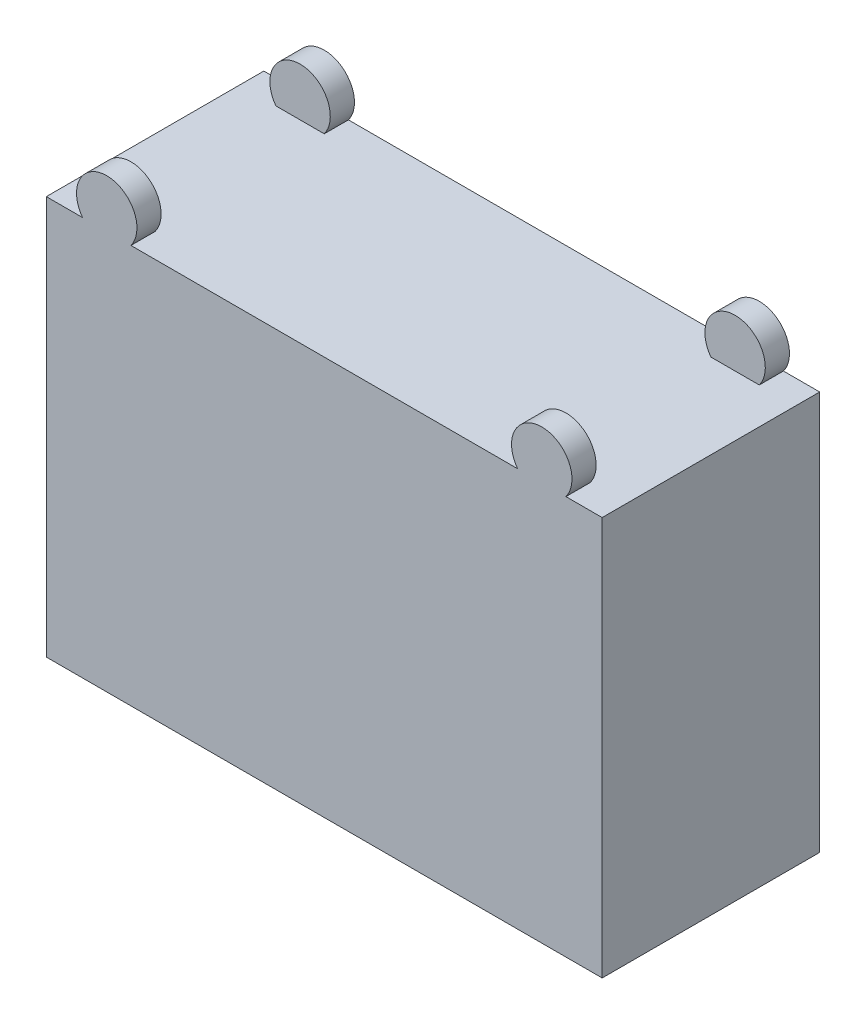
ISO-10303-21;
HEADER;
FILE_DESCRIPTION(('STEP AP214'),'2;1');
FILE_NAME('part.step','',(''),(''),'','','');
FILE_SCHEMA(('AUTOMOTIVE_DESIGN { 1 0 10303 214 1 1 1 1 }'));
ENDSEC;
DATA;
#1=APPLICATION_CONTEXT('core data for automotive mechanical design processes');
#2=APPLICATION_PROTOCOL_DEFINITION('international standard','automotive_design',2000,#1);
#3=PRODUCT_CONTEXT('',#1,'mechanical');
#4=PRODUCT('Part','Part','',(#3));
#5=PRODUCT_RELATED_PRODUCT_CATEGORY('part','',(#4));
#6=PRODUCT_DEFINITION_FORMATION('','',#4);
#7=PRODUCT_DEFINITION_CONTEXT('part definition',#1,'design');
#8=PRODUCT_DEFINITION('design','',#6,#7);
#9=PRODUCT_DEFINITION_SHAPE('','',#8);
#10=(LENGTH_UNIT() NAMED_UNIT(*) SI_UNIT(.MILLI.,.METRE.));
#11=(NAMED_UNIT(*) PLANE_ANGLE_UNIT() SI_UNIT($,.RADIAN.));
#12=(NAMED_UNIT(*) SI_UNIT($,.STERADIAN.) SOLID_ANGLE_UNIT());
#13=UNCERTAINTY_MEASURE_WITH_UNIT(LENGTH_MEASURE(1.E-05),#10,'distance_accuracy_value','');
#14=(GEOMETRIC_REPRESENTATION_CONTEXT(3) GLOBAL_UNCERTAINTY_ASSIGNED_CONTEXT((#13)) GLOBAL_UNIT_ASSIGNED_CONTEXT((#10,
#11,#12)) REPRESENTATION_CONTEXT('',''));
#15=CARTESIAN_POINT('',(0.,0.,0.));
#16=DIRECTION('',(0.,0.,1.));
#17=DIRECTION('',(1.,0.,0.));
#18=AXIS2_PLACEMENT_3D('',#15,#16,#17);
#19=CARTESIAN_POINT('',(0.,838.2,0.));
#20=DIRECTION('',(0.,1.,0.));
#21=DIRECTION('',(0.,0.,1.));
#22=AXIS2_PLACEMENT_3D('',#19,#20,#21);
#23=PLANE('',#22);
#24=DIRECTION('',(-1.,0.,0.));
#25=VECTOR('',#24,1.);
#26=CARTESIAN_POINT('',(-584.2,838.2,-228.6));
#27=LINE('',#26,#25);
#28=CARTESIAN_POINT('',(584.2,838.2,-228.6));
#29=VERTEX_POINT('',#28);
#30=CARTESIAN_POINT('',(508.,838.2,-228.6));
#31=VERTEX_POINT('',#30);
#32=EDGE_CURVE('E126',#29,#31,#27,.T.);
#33=ORIENTED_EDGE('',*,*,#32,.T.);
#34=DIRECTION('',(0.,0.,-1.));
#35=VECTOR('',#34,1.);
#36=CARTESIAN_POINT('',(508.,838.2,-177.8));
#37=LINE('',#36,#35);
#38=CARTESIAN_POINT('',(508.,838.2,-177.8));
#39=VERTEX_POINT('',#38);
#40=EDGE_CURVE('E50',#31,#39,#37,.F.);
#41=ORIENTED_EDGE('',*,*,#40,.T.);
#42=DIRECTION('',(-1.,0.,0.));
#43=VECTOR('',#42,1.);
#44=CARTESIAN_POINT('',(0.,838.2,-177.8));
#45=LINE('',#44,#43);
#46=CARTESIAN_POINT('',(406.4,838.2,-177.8));
#47=VERTEX_POINT('',#46);
#48=EDGE_CURVE('E11',#39,#47,#45,.T.);
#49=ORIENTED_EDGE('',*,*,#48,.T.);
#50=DIRECTION('',(0.,0.,-1.));
#51=VECTOR('',#50,1.);
#52=CARTESIAN_POINT('',(406.4,838.2,-177.8));
#53=LINE('',#52,#51);
#54=CARTESIAN_POINT('',(406.4,838.2,-228.6));
#55=VERTEX_POINT('',#54);
#56=EDGE_CURVE('E129',#47,#55,#53,.T.);
#57=ORIENTED_EDGE('',*,*,#56,.T.);
#58=CARTESIAN_POINT('',(-406.4,838.2,-228.6));
#59=VERTEX_POINT('',#58);
#60=EDGE_CURVE('E118',#55,#59,#27,.T.);
#61=ORIENTED_EDGE('',*,*,#60,.T.);
#62=DIRECTION('',(0.,0.,-1.));
#63=VECTOR('',#62,1.);
#64=CARTESIAN_POINT('',(-406.4,838.2,-177.8));
#65=LINE('',#64,#63);
#66=CARTESIAN_POINT('',(-406.4,838.2,-177.8));
#67=VERTEX_POINT('',#66);
#68=EDGE_CURVE('E40',#59,#67,#65,.F.);
#69=ORIENTED_EDGE('',*,*,#68,.T.);
#70=DIRECTION('',(-1.,0.,0.));
#71=VECTOR('',#70,1.);
#72=CARTESIAN_POINT('',(0.,838.2,-177.8));
#73=LINE('',#72,#71);
#74=CARTESIAN_POINT('',(-508.,838.2,-177.8));
#75=VERTEX_POINT('',#74);
#76=EDGE_CURVE('E202',#67,#75,#73,.T.);
#77=ORIENTED_EDGE('',*,*,#76,.T.);
#78=DIRECTION('',(0.,0.,-1.));
#79=VECTOR('',#78,1.);
#80=CARTESIAN_POINT('',(-508.,838.2,-177.8));
#81=LINE('',#80,#79);
#82=CARTESIAN_POINT('',(-508.,838.2,-228.6));
#83=VERTEX_POINT('',#82);
#84=EDGE_CURVE('E204',#75,#83,#81,.T.);
#85=ORIENTED_EDGE('',*,*,#84,.T.);
#86=CARTESIAN_POINT('',(-584.2,838.2,-228.6));
#87=VERTEX_POINT('',#86);
#88=EDGE_CURVE('E127',#83,#87,#27,.T.);
#89=ORIENTED_EDGE('',*,*,#88,.T.);
#90=DIRECTION('',(0.,0.,1.));
#91=VECTOR('',#90,1.);
#92=CARTESIAN_POINT('',(-584.2,838.2,-228.6));
#93=LINE('',#92,#91);
#94=CARTESIAN_POINT('',(-584.2,838.2,228.6));
#95=VERTEX_POINT('',#94);
#96=EDGE_CURVE('E157',#87,#95,#93,.T.);
#97=ORIENTED_EDGE('',*,*,#96,.T.);
#98=DIRECTION('',(1.,0.,0.));
#99=VECTOR('',#98,1.);
#100=CARTESIAN_POINT('',(-584.2,838.2,228.6));
#101=LINE('',#100,#99);
#102=CARTESIAN_POINT('',(-508.,838.2,228.6));
#103=VERTEX_POINT('',#102);
#104=EDGE_CURVE('E162',#95,#103,#101,.T.);
#105=ORIENTED_EDGE('',*,*,#104,.T.);
#106=DIRECTION('',(0.,0.,1.));
#107=VECTOR('',#106,1.);
#108=CARTESIAN_POINT('',(-508.,838.2,177.8));
#109=LINE('',#108,#107);
#110=CARTESIAN_POINT('',(-508.,838.2,177.8));
#111=VERTEX_POINT('',#110);
#112=EDGE_CURVE('E191',#111,#103,#109,.T.);
#113=ORIENTED_EDGE('',*,*,#112,.F.);
#114=DIRECTION('',(1.,0.,0.));
#115=VECTOR('',#114,1.);
#116=CARTESIAN_POINT('',(0.,838.2,177.8));
#117=LINE('',#116,#115);
#118=CARTESIAN_POINT('',(-406.4,838.2,177.8));
#119=VERTEX_POINT('',#118);
#120=EDGE_CURVE('E186',#111,#119,#117,.T.);
#121=ORIENTED_EDGE('',*,*,#120,.T.);
#122=DIRECTION('',(0.,0.,1.));
#123=VECTOR('',#122,1.);
#124=CARTESIAN_POINT('',(-406.4,838.2,177.8));
#125=LINE('',#124,#123);
#126=CARTESIAN_POINT('',(-406.4,838.2,228.6));
#127=VERTEX_POINT('',#126);
#128=EDGE_CURVE('E188',#127,#119,#125,.F.);
#129=ORIENTED_EDGE('',*,*,#128,.F.);
#130=CARTESIAN_POINT('',(406.4,838.2,228.6));
#131=VERTEX_POINT('',#130);
#132=EDGE_CURVE('E165',#127,#131,#101,.T.);
#133=ORIENTED_EDGE('',*,*,#132,.T.);
#134=DIRECTION('',(0.,0.,1.));
#135=VECTOR('',#134,1.);
#136=CARTESIAN_POINT('',(406.4,838.2,177.8));
#137=LINE('',#136,#135);
#138=CARTESIAN_POINT('',(406.4,838.2,177.8));
#139=VERTEX_POINT('',#138);
#140=EDGE_CURVE('E199',#139,#131,#137,.T.);
#141=ORIENTED_EDGE('',*,*,#140,.F.);
#142=DIRECTION('',(1.,0.,0.));
#143=VECTOR('',#142,1.);
#144=CARTESIAN_POINT('',(0.,838.2,177.8));
#145=LINE('',#144,#143);
#146=CARTESIAN_POINT('',(508.,838.2,177.8));
#147=VERTEX_POINT('',#146);
#148=EDGE_CURVE('E194',#139,#147,#145,.T.);
#149=ORIENTED_EDGE('',*,*,#148,.T.);
#150=DIRECTION('',(0.,0.,1.));
#151=VECTOR('',#150,1.);
#152=CARTESIAN_POINT('',(508.,838.2,177.8));
#153=LINE('',#152,#151);
#154=CARTESIAN_POINT('',(508.,838.2,228.6));
#155=VERTEX_POINT('',#154);
#156=EDGE_CURVE('E196',#155,#147,#153,.F.);
#157=ORIENTED_EDGE('',*,*,#156,.F.);
#158=CARTESIAN_POINT('',(584.2,838.2,228.6));
#159=VERTEX_POINT('',#158);
#160=EDGE_CURVE('E160',#155,#159,#101,.T.);
#161=ORIENTED_EDGE('',*,*,#160,.T.);
#162=DIRECTION('',(0.,0.,-1.));
#163=VECTOR('',#162,1.);
#164=CARTESIAN_POINT('',(584.2,838.2,-228.6));
#165=LINE('',#164,#163);
#166=EDGE_CURVE('E164',#159,#29,#165,.T.);
#167=ORIENTED_EDGE('',*,*,#166,.T.);
#168=EDGE_LOOP('',(#33,#41,#49,#57,#61,#69,#77,#85,#89,#97,#105,#113,#121,#129,#133,#141,#149,
#157,#161,#167));
#169=FACE_BOUND('',#168,.T.);
#170=ADVANCED_FACE('F32',(#169),#23,.T.);
#171=CARTESIAN_POINT('',(-584.2,838.2,-228.6));
#172=DIRECTION('',(1.,0.,0.));
#173=DIRECTION('',(0.,0.,-1.));
#174=AXIS2_PLACEMENT_3D('',#171,#172,#173);
#175=PLANE('',#174);
#176=DIRECTION('',(0.,0.,1.));
#177=VECTOR('',#176,1.);
#178=CARTESIAN_POINT('',(-584.2,0.,-228.6));
#179=LINE('',#178,#177);
#180=CARTESIAN_POINT('',(-584.2,0.,-228.6));
#181=VERTEX_POINT('',#180);
#182=CARTESIAN_POINT('',(-584.2,0.,228.6));
#183=VERTEX_POINT('',#182);
#184=EDGE_CURVE('E154',#181,#183,#179,.T.);
#185=ORIENTED_EDGE('',*,*,#184,.T.);
#186=DIRECTION('',(0.,-1.,0.));
#187=VECTOR('',#186,1.);
#188=CARTESIAN_POINT('',(-584.2,838.2,228.6));
#189=LINE('',#188,#187);
#190=EDGE_CURVE('E183',#95,#183,#189,.T.);
#191=ORIENTED_EDGE('',*,*,#190,.F.);
#192=ORIENTED_EDGE('',*,*,#96,.F.);
#193=DIRECTION('',(0.,-1.,0.));
#194=VECTOR('',#193,1.);
#195=CARTESIAN_POINT('',(-584.2,838.2,-228.6));
#196=LINE('',#195,#194);
#197=EDGE_CURVE('E167',#87,#181,#196,.T.);
#198=ORIENTED_EDGE('',*,*,#197,.T.);
#199=EDGE_LOOP('',(#185,#191,#192,#198));
#200=FACE_BOUND('',#199,.T.);
#201=ADVANCED_FACE('F34',(#200),#175,.F.);
#202=CARTESIAN_POINT('',(-584.2,838.2,228.6));
#203=DIRECTION('',(0.,0.,-1.));
#204=DIRECTION('',(-1.,0.,0.));
#205=AXIS2_PLACEMENT_3D('',#202,#203,#204);
#206=PLANE('',#205);
#207=ORIENTED_EDGE('',*,*,#160,.F.);
#208=CARTESIAN_POINT('',(457.2,876.3,228.6));
#209=DIRECTION('',(0.,0.,1.));
#210=DIRECTION('',(1.,0.,0.));
#211=AXIS2_PLACEMENT_3D('',#208,#209,#210);
#212=CIRCLE('',#211,63.5);
#213=EDGE_CURVE('E143',#155,#131,#212,.T.);
#214=ORIENTED_EDGE('',*,*,#213,.T.);
#215=ORIENTED_EDGE('',*,*,#132,.F.);
#216=CARTESIAN_POINT('',(-457.2,876.3,228.6));
#217=DIRECTION('',(0.,0.,1.));
#218=DIRECTION('',(1.,0.,0.));
#219=AXIS2_PLACEMENT_3D('',#216,#217,#218);
#220=CIRCLE('',#219,63.5000000000001);
#221=EDGE_CURVE('E148',#127,#103,#220,.T.);
#222=ORIENTED_EDGE('',*,*,#221,.T.);
#223=ORIENTED_EDGE('',*,*,#104,.F.);
#224=ORIENTED_EDGE('',*,*,#190,.T.);
#225=DIRECTION('',(1.,0.,0.));
#226=VECTOR('',#225,1.);
#227=CARTESIAN_POINT('',(-584.2,0.,228.6));
#228=LINE('',#227,#226);
#229=CARTESIAN_POINT('',(584.2,0.,228.6));
#230=VERTEX_POINT('',#229);
#231=EDGE_CURVE('E170',#183,#230,#228,.T.);
#232=ORIENTED_EDGE('',*,*,#231,.T.);
#233=DIRECTION('',(0.,-1.,0.));
#234=VECTOR('',#233,1.);
#235=CARTESIAN_POINT('',(584.2,838.2,228.6));
#236=LINE('',#235,#234);
#237=EDGE_CURVE('E180',#159,#230,#236,.T.);
#238=ORIENTED_EDGE('',*,*,#237,.F.);
#239=EDGE_LOOP('',(#207,#214,#215,#222,#223,#224,#232,#238));
#240=FACE_BOUND('',#239,.T.);
#241=ADVANCED_FACE('F220',(#240),#206,.F.);
#242=CARTESIAN_POINT('',(584.2,838.2,-228.6));
#243=DIRECTION('',(-1.,0.,0.));
#244=DIRECTION('',(0.,0.,1.));
#245=AXIS2_PLACEMENT_3D('',#242,#243,#244);
#246=PLANE('',#245);
#247=DIRECTION('',(0.,0.,-1.));
#248=VECTOR('',#247,1.);
#249=CARTESIAN_POINT('',(584.2,0.,-228.6));
#250=LINE('',#249,#248);
#251=CARTESIAN_POINT('',(584.2,0.,-228.6));
#252=VERTEX_POINT('',#251);
#253=EDGE_CURVE('E172',#230,#252,#250,.T.);
#254=ORIENTED_EDGE('',*,*,#253,.T.);
#255=DIRECTION('',(0.,-1.,0.));
#256=VECTOR('',#255,1.);
#257=CARTESIAN_POINT('',(584.2,838.2,-228.6));
#258=LINE('',#257,#256);
#259=EDGE_CURVE('E177',#29,#252,#258,.T.);
#260=ORIENTED_EDGE('',*,*,#259,.F.);
#261=ORIENTED_EDGE('',*,*,#166,.F.);
#262=ORIENTED_EDGE('',*,*,#237,.T.);
#263=EDGE_LOOP('',(#254,#260,#261,#262));
#264=FACE_BOUND('',#263,.T.);
#265=ADVANCED_FACE('F261',(#264),#246,.F.);
#266=CARTESIAN_POINT('',(-584.2,838.2,-228.6));
#267=DIRECTION('',(0.,0.,1.));
#268=DIRECTION('',(1.,0.,0.));
#269=AXIS2_PLACEMENT_3D('',#266,#267,#268);
#270=PLANE('',#269);
#271=ORIENTED_EDGE('',*,*,#60,.F.);
#272=CARTESIAN_POINT('',(457.2,876.3,-228.6));
#273=DIRECTION('',(0.,0.,1.));
#274=DIRECTION('',(1.,0.,0.));
#275=AXIS2_PLACEMENT_3D('',#272,#273,#274);
#276=CIRCLE('',#275,63.5);
#277=EDGE_CURVE('E122',#31,#55,#276,.T.);
#278=ORIENTED_EDGE('',*,*,#277,.F.);
#279=ORIENTED_EDGE('',*,*,#32,.F.);
#280=ORIENTED_EDGE('',*,*,#259,.T.);
#281=DIRECTION('',(-1.,0.,0.));
#282=VECTOR('',#281,1.);
#283=CARTESIAN_POINT('',(-584.2,0.,-228.6));
#284=LINE('',#283,#282);
#285=EDGE_CURVE('E161',#252,#181,#284,.T.);
#286=ORIENTED_EDGE('',*,*,#285,.T.);
#287=ORIENTED_EDGE('',*,*,#197,.F.);
#288=ORIENTED_EDGE('',*,*,#88,.F.);
#289=CARTESIAN_POINT('',(-457.2,876.3,-228.6));
#290=DIRECTION('',(0.,0.,1.));
#291=DIRECTION('',(1.,0.,0.));
#292=AXIS2_PLACEMENT_3D('',#289,#290,#291);
#293=CIRCLE('',#292,63.5000000000001);
#294=EDGE_CURVE('E124',#59,#83,#293,.T.);
#295=ORIENTED_EDGE('',*,*,#294,.F.);
#296=EDGE_LOOP('',(#271,#278,#279,#280,#286,#287,#288,#295));
#297=FACE_BOUND('',#296,.T.);
#298=ADVANCED_FACE('F119',(#297),#270,.F.);
#299=CARTESIAN_POINT('',(0.,0.,0.));
#300=DIRECTION('',(0.,1.,0.));
#301=DIRECTION('',(0.,0.,1.));
#302=AXIS2_PLACEMENT_3D('',#299,#300,#301);
#303=PLANE('',#302);
#304=ORIENTED_EDGE('',*,*,#184,.F.);
#305=ORIENTED_EDGE('',*,*,#285,.F.);
#306=ORIENTED_EDGE('',*,*,#253,.F.);
#307=ORIENTED_EDGE('',*,*,#231,.F.);
#308=EDGE_LOOP('',(#304,#305,#306,#307));
#309=FACE_BOUND('',#308,.T.);
#310=ADVANCED_FACE('F255',(#309),#303,.F.);
#311=CARTESIAN_POINT('',(-457.2,876.3,177.8));
#312=DIRECTION('',(0.,0.,1.));
#313=DIRECTION('',(1.,0.,0.));
#314=AXIS2_PLACEMENT_3D('',#311,#312,#313);
#315=CYLINDRICAL_SURFACE('',#314,63.5000000000001);
#316=CARTESIAN_POINT('',(-457.2,876.3,177.8));
#317=DIRECTION('',(0.,0.,1.));
#318=DIRECTION('',(1.,0.,0.));
#319=AXIS2_PLACEMENT_3D('',#316,#317,#318);
#320=CIRCLE('',#319,63.5000000000001);
#321=EDGE_CURVE('E151',#119,#111,#320,.T.);
#322=ORIENTED_EDGE('',*,*,#321,.T.);
#323=ORIENTED_EDGE('',*,*,#112,.T.);
#324=ORIENTED_EDGE('',*,*,#221,.F.);
#325=ORIENTED_EDGE('',*,*,#128,.T.);
#326=EDGE_LOOP('',(#322,#323,#324,#325));
#327=FACE_BOUND('',#326,.T.);
#328=ADVANCED_FACE('F225',(#327),#315,.T.);
#329=CARTESIAN_POINT('',(-457.2,876.3,177.8));
#330=DIRECTION('',(0.,0.,1.));
#331=DIRECTION('',(1.,0.,0.));
#332=AXIS2_PLACEMENT_3D('',#329,#330,#331);
#333=PLANE('',#332);
#334=ORIENTED_EDGE('',*,*,#120,.F.);
#335=ORIENTED_EDGE('',*,*,#321,.F.);
#336=EDGE_LOOP('',(#334,#335));
#337=FACE_BOUND('',#336,.T.);
#338=ADVANCED_FACE('F229',(#337),#333,.F.);
#339=CARTESIAN_POINT('',(457.2,876.3,177.8));
#340=DIRECTION('',(0.,0.,1.));
#341=DIRECTION('',(1.,0.,0.));
#342=AXIS2_PLACEMENT_3D('',#339,#340,#341);
#343=CYLINDRICAL_SURFACE('',#342,63.5);
#344=CARTESIAN_POINT('',(457.2,876.3,177.8));
#345=DIRECTION('',(0.,0.,1.));
#346=DIRECTION('',(1.,0.,0.));
#347=AXIS2_PLACEMENT_3D('',#344,#345,#346);
#348=CIRCLE('',#347,63.5);
#349=EDGE_CURVE('E145',#147,#139,#348,.T.);
#350=ORIENTED_EDGE('',*,*,#349,.T.);
#351=ORIENTED_EDGE('',*,*,#140,.T.);
#352=ORIENTED_EDGE('',*,*,#213,.F.);
#353=ORIENTED_EDGE('',*,*,#156,.T.);
#354=EDGE_LOOP('',(#350,#351,#352,#353));
#355=FACE_BOUND('',#354,.T.);
#356=ADVANCED_FACE('F233',(#355),#343,.T.);
#357=CARTESIAN_POINT('',(457.2,876.3,177.8));
#358=DIRECTION('',(0.,0.,1.));
#359=DIRECTION('',(1.,0.,0.));
#360=AXIS2_PLACEMENT_3D('',#357,#358,#359);
#361=PLANE('',#360);
#362=ORIENTED_EDGE('',*,*,#148,.F.);
#363=ORIENTED_EDGE('',*,*,#349,.F.);
#364=EDGE_LOOP('',(#362,#363));
#365=FACE_BOUND('',#364,.T.);
#366=ADVANCED_FACE('F238',(#365),#361,.F.);
#367=CARTESIAN_POINT('',(-457.2,876.3,-177.8));
#368=DIRECTION('',(0.,0.,-1.));
#369=DIRECTION('',(-1.,0.,0.));
#370=AXIS2_PLACEMENT_3D('',#367,#368,#369);
#371=CYLINDRICAL_SURFACE('',#370,63.5000000000001);
#372=ORIENTED_EDGE('',*,*,#68,.F.);
#373=ORIENTED_EDGE('',*,*,#294,.T.);
#374=ORIENTED_EDGE('',*,*,#84,.F.);
#375=CARTESIAN_POINT('',(-457.2,876.3,-177.8));
#376=DIRECTION('',(0.,0.,1.));
#377=DIRECTION('',(1.,0.,0.));
#378=AXIS2_PLACEMENT_3D('',#375,#376,#377);
#379=CIRCLE('',#378,63.5000000000001);
#380=EDGE_CURVE('E140',#67,#75,#379,.T.);
#381=ORIENTED_EDGE('',*,*,#380,.F.);
#382=EDGE_LOOP('',(#372,#373,#374,#381));
#383=FACE_BOUND('',#382,.T.);
#384=ADVANCED_FACE('F212',(#383),#371,.T.);
#385=CARTESIAN_POINT('',(-457.2,876.3,-177.8));
#386=DIRECTION('',(0.,0.,-1.));
#387=DIRECTION('',(1.,0.,0.));
#388=AXIS2_PLACEMENT_3D('',#385,#386,#387);
#389=PLANE('',#388);
#390=ORIENTED_EDGE('',*,*,#76,.F.);
#391=ORIENTED_EDGE('',*,*,#380,.T.);
#392=EDGE_LOOP('',(#390,#391));
#393=FACE_BOUND('',#392,.T.);
#394=ADVANCED_FACE('F211',(#393),#389,.F.);
#395=CARTESIAN_POINT('',(457.2,876.3,-177.8));
#396=DIRECTION('',(0.,0.,-1.));
#397=DIRECTION('',(-1.,0.,0.));
#398=AXIS2_PLACEMENT_3D('',#395,#396,#397);
#399=CYLINDRICAL_SURFACE('',#398,63.5);
#400=ORIENTED_EDGE('',*,*,#40,.F.);
#401=ORIENTED_EDGE('',*,*,#277,.T.);
#402=ORIENTED_EDGE('',*,*,#56,.F.);
#403=CARTESIAN_POINT('',(457.2,876.3,-177.8));
#404=DIRECTION('',(0.,0.,1.));
#405=DIRECTION('',(1.,0.,0.));
#406=AXIS2_PLACEMENT_3D('',#403,#404,#405);
#407=CIRCLE('',#406,63.5);
#408=EDGE_CURVE('E133',#39,#47,#407,.T.);
#409=ORIENTED_EDGE('',*,*,#408,.F.);
#410=EDGE_LOOP('',(#400,#401,#402,#409));
#411=FACE_BOUND('',#410,.T.);
#412=ADVANCED_FACE('F135',(#411),#399,.T.);
#413=CARTESIAN_POINT('',(457.2,876.3,-177.8));
#414=DIRECTION('',(0.,0.,-1.));
#415=DIRECTION('',(1.,0.,0.));
#416=AXIS2_PLACEMENT_3D('',#413,#414,#415);
#417=PLANE('',#416);
#418=ORIENTED_EDGE('',*,*,#48,.F.);
#419=ORIENTED_EDGE('',*,*,#408,.T.);
#420=EDGE_LOOP('',(#418,#419));
#421=FACE_BOUND('',#420,.T.);
#422=ADVANCED_FACE('F330',(#421),#417,.F.);
#423=CLOSED_SHELL('',(#170,#201,#241,#265,#298,#310,#328,#338,#356,#366,#384,#394,#412,#422));
#424=MANIFOLD_SOLID_BREP('B2',#423);
#425=ADVANCED_BREP_SHAPE_REPRESENTATION('',(#18,#424),#14);
#426=SHAPE_DEFINITION_REPRESENTATION(#9,#425);
ENDSEC;
END-ISO-10303-21;
